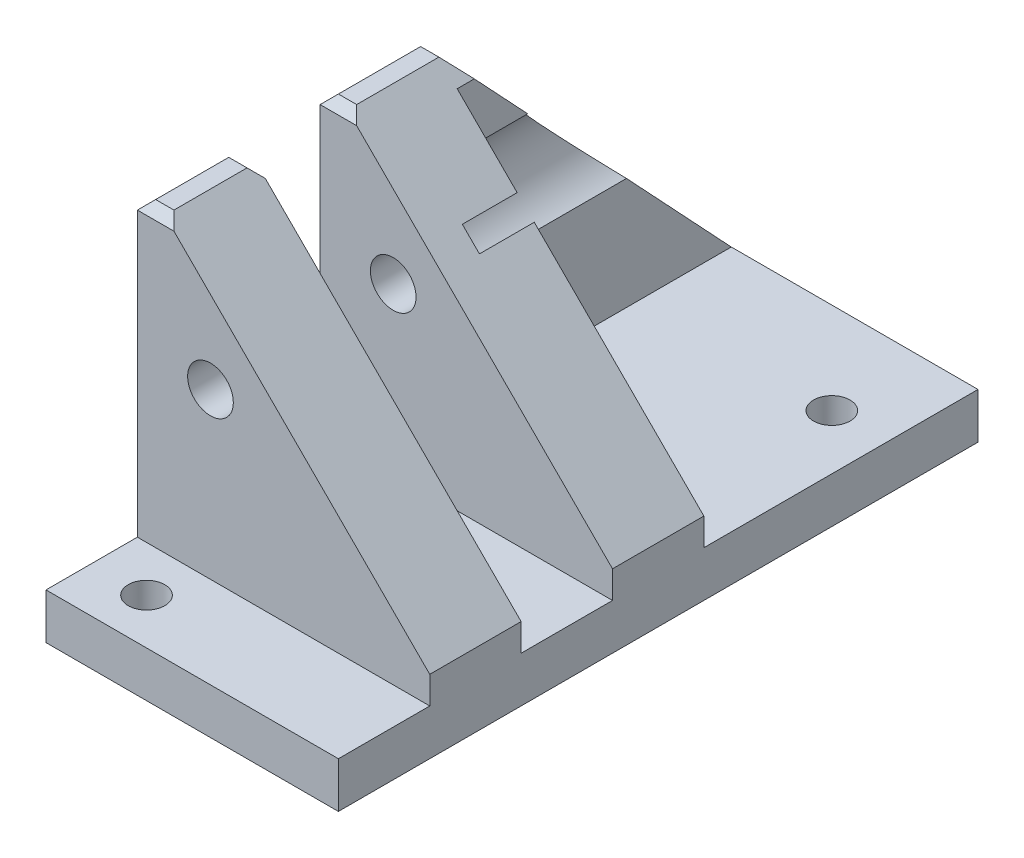
ISO-10303-21;
HEADER;
FILE_DESCRIPTION(('STEP AP214'),'2;1');
FILE_NAME('part.step','',(''),(''),'','','');
FILE_SCHEMA(('AUTOMOTIVE_DESIGN { 1 0 10303 214 1 1 1 1 }'));
ENDSEC;
DATA;
#1=APPLICATION_CONTEXT('core data for automotive mechanical design processes');
#2=APPLICATION_PROTOCOL_DEFINITION('international standard','automotive_design',2000,#1);
#3=PRODUCT_CONTEXT('',#1,'mechanical');
#4=PRODUCT('Part','Part','',(#3));
#5=PRODUCT_RELATED_PRODUCT_CATEGORY('part','',(#4));
#6=PRODUCT_DEFINITION_FORMATION('','',#4);
#7=PRODUCT_DEFINITION_CONTEXT('part definition',#1,'design');
#8=PRODUCT_DEFINITION('design','',#6,#7);
#9=PRODUCT_DEFINITION_SHAPE('','',#8);
#10=(LENGTH_UNIT() NAMED_UNIT(*) SI_UNIT(.MILLI.,.METRE.));
#11=(NAMED_UNIT(*) PLANE_ANGLE_UNIT() SI_UNIT($,.RADIAN.));
#12=(NAMED_UNIT(*) SI_UNIT($,.STERADIAN.) SOLID_ANGLE_UNIT());
#13=UNCERTAINTY_MEASURE_WITH_UNIT(LENGTH_MEASURE(1.E-05),#10,'distance_accuracy_value','');
#14=(GEOMETRIC_REPRESENTATION_CONTEXT(3) GLOBAL_UNCERTAINTY_ASSIGNED_CONTEXT((#13)) GLOBAL_UNIT_ASSIGNED_CONTEXT((#10,
#11,#12)) REPRESENTATION_CONTEXT('',''));
#15=CARTESIAN_POINT('',(0.,0.,0.));
#16=DIRECTION('',(0.,0.,1.));
#17=DIRECTION('',(1.,0.,0.));
#18=AXIS2_PLACEMENT_3D('',#15,#16,#17);
#19=CARTESIAN_POINT('',(5.00000000000001,5.,30.));
#20=DIRECTION('',(0.,0.,1.));
#21=DIRECTION('',(1.,0.,0.));
#22=AXIS2_PLACEMENT_3D('',#19,#20,#21);
#23=PLANE('',#22);
#24=DIRECTION('',(-0.707106781186548,0.707106781186547,0.));
#25=VECTOR('',#24,1.);
#26=CARTESIAN_POINT('',(0.,40.,30.));
#27=LINE('',#26,#25);
#28=CARTESIAN_POINT('',(11.5645856533065,28.4354143466935,30.));
#29=VERTEX_POINT('',#28);
#30=CARTESIAN_POINT('',(5.00000000000001,35.,30.));
#31=VERTEX_POINT('',#30);
#32=EDGE_CURVE('E346',#29,#31,#27,.T.);
#33=ORIENTED_EDGE('',*,*,#32,.F.);
#34=CARTESIAN_POINT('',(8.00000000000001,23.,30.));
#35=DIRECTION('',(0.,0.,1.));
#36=DIRECTION('',(1.,0.,0.));
#37=AXIS2_PLACEMENT_3D('',#34,#35,#36);
#38=CIRCLE('',#37,6.5);
#39=CARTESIAN_POINT('',(5.00000000000001,28.7662812973354,30.));
#40=VERTEX_POINT('',#39);
#41=EDGE_CURVE('E193',#29,#40,#38,.T.);
#42=ORIENTED_EDGE('',*,*,#41,.T.);
#43=DIRECTION('',(0.,-1.,0.));
#44=VECTOR('',#43,1.);
#45=CARTESIAN_POINT('',(5.00000000000001,5.,30.));
#46=LINE('',#45,#44);
#47=EDGE_CURVE('E258',#31,#40,#46,.T.);
#48=ORIENTED_EDGE('',*,*,#47,.F.);
#49=EDGE_LOOP('',(#33,#42,#48));
#50=FACE_BOUND('',#49,.T.);
#51=ADVANCED_FACE('F33',(#50),#23,.F.);
#52=CARTESIAN_POINT('',(5.00000000000001,37.,30.));
#53=DIRECTION('',(-1.,0.,0.));
#54=DIRECTION('',(0.,0.,1.));
#55=AXIS2_PLACEMENT_3D('',#52,#53,#54);
#56=PLANE('',#55);
#57=ORIENTED_EDGE('',*,*,#47,.T.);
#58=DIRECTION('',(0.,0.,-1.));
#59=VECTOR('',#58,1.);
#60=CARTESIAN_POINT('',(5.00000000000001,28.7662812973354,36.));
#61=LINE('',#60,#59);
#62=CARTESIAN_POINT('',(5.00000000000001,28.7662812973354,22.2808887162519));
#63=VERTEX_POINT('',#62);
#64=EDGE_CURVE('E212',#40,#63,#61,.T.);
#65=ORIENTED_EDGE('',*,*,#64,.T.);
#66=DIRECTION('',(0.,-0.729537204140085,-0.68394112888133));
#67=VECTOR('',#66,1.);
#68=CARTESIAN_POINT('',(5.00000000000001,37.,30.));
#69=LINE('',#68,#67);
#70=CARTESIAN_POINT('',(5.00000000000001,35.,28.125));
#71=VERTEX_POINT('',#70);
#72=EDGE_CURVE('E239',#71,#63,#69,.T.);
#73=ORIENTED_EDGE('',*,*,#72,.F.);
#74=DIRECTION('',(0.,0.,-1.));
#75=VECTOR('',#74,1.);
#76=CARTESIAN_POINT('',(5.00000000000001,35.,0.));
#77=LINE('',#76,#75);
#78=EDGE_CURVE('E343',#31,#71,#77,.T.);
#79=ORIENTED_EDGE('',*,*,#78,.F.);
#80=EDGE_LOOP('',(#57,#65,#73,#79));
#81=FACE_BOUND('',#80,.T.);
#82=ADVANCED_FACE('F451',(#81),#56,.F.);
#83=CARTESIAN_POINT('',(8.00000000000001,23.,0.));
#84=DIRECTION('',(0.,0.,1.));
#85=DIRECTION('',(1.,0.,0.));
#86=AXIS2_PLACEMENT_3D('',#83,#84,#85);
#87=CYLINDRICAL_SURFACE('',#86,2.5);
#88=CARTESIAN_POINT('',(8.00000000000001,23.,40.));
#89=DIRECTION('',(0.,0.,-1.));
#90=DIRECTION('',(0.,1.,0.));
#91=AXIS2_PLACEMENT_3D('',#88,#89,#90);
#92=CIRCLE('',#91,2.5);
#93=CARTESIAN_POINT('',(8.00000000000001,25.5,40.));
#94=VERTEX_POINT('',#93);
#95=EDGE_CURVE('E197',#94,#94,#92,.T.);
#96=ORIENTED_EDGE('',*,*,#95,.F.);
#97=EDGE_LOOP('',(#96));
#98=FACE_BOUND('',#97,.T.);
#99=CARTESIAN_POINT('',(8.00000000000001,23.,36.));
#100=DIRECTION('',(0.,0.,-1.));
#101=DIRECTION('',(-1.,0.,0.));
#102=AXIS2_PLACEMENT_3D('',#99,#100,#101);
#103=CIRCLE('',#102,2.5);
#104=CARTESIAN_POINT('',(5.50000000000001,23.,36.));
#105=VERTEX_POINT('',#104);
#106=EDGE_CURVE('E203',#105,#105,#103,.F.);
#107=ORIENTED_EDGE('',*,*,#106,.F.);
#108=EDGE_LOOP('',(#107));
#109=FACE_BOUND('',#108,.T.);
#110=ADVANCED_FACE('F460',(#98,#109),#87,.F.);
#111=CARTESIAN_POINT('',(0.,50.,70.));
#112=DIRECTION('',(1.,0.,0.));
#113=DIRECTION('',(0.,1.,0.));
#114=AXIS2_PLACEMENT_3D('',#111,#112,#113);
#115=PLANE('',#114);
#116=DIRECTION('',(0.,1.,0.));
#117=VECTOR('',#116,1.);
#118=CARTESIAN_POINT('',(0.,50.,40.));
#119=LINE('',#118,#117);
#120=CARTESIAN_POINT('',(0.,5.,40.));
#121=VERTEX_POINT('',#120);
#122=CARTESIAN_POINT('',(0.,36.,40.));
#123=VERTEX_POINT('',#122);
#124=EDGE_CURVE('E291',#121,#123,#119,.T.);
#125=ORIENTED_EDGE('',*,*,#124,.T.);
#126=DIRECTION('',(0.,0.,-1.));
#127=VECTOR('',#126,1.);
#128=CARTESIAN_POINT('',(0.,36.,70.));
#129=LINE('',#128,#127);
#130=CARTESIAN_POINT('',(0.,36.,29.0625));
#131=VERTEX_POINT('',#130);
#132=EDGE_CURVE('E367',#123,#131,#129,.T.);
#133=ORIENTED_EDGE('',*,*,#132,.T.);
#134=DIRECTION('',(0.,-0.729537204140085,-0.68394112888133));
#135=VECTOR('',#134,1.);
#136=CARTESIAN_POINT('',(0.,37.,30.));
#137=LINE('',#136,#135);
#138=CARTESIAN_POINT('',(0.,5.,0.));
#139=VERTEX_POINT('',#138);
#140=EDGE_CURVE('E242',#131,#139,#137,.T.);
#141=ORIENTED_EDGE('',*,*,#140,.T.);
#142=DIRECTION('',(0.,-1.,0.));
#143=VECTOR('',#142,1.);
#144=CARTESIAN_POINT('',(0.,50.,0.));
#145=LINE('',#144,#143);
#146=CARTESIAN_POINT('',(0.,0.,0.));
#147=VERTEX_POINT('',#146);
#148=EDGE_CURVE('E321',#139,#147,#145,.T.);
#149=ORIENTED_EDGE('',*,*,#148,.T.);
#150=DIRECTION('',(0.,0.,-1.));
#151=VECTOR('',#150,1.);
#152=CARTESIAN_POINT('',(0.,0.,70.));
#153=LINE('',#152,#151);
#154=CARTESIAN_POINT('',(0.,0.,70.));
#155=VERTEX_POINT('',#154);
#156=EDGE_CURVE('E331',#155,#147,#153,.T.);
#157=ORIENTED_EDGE('',*,*,#156,.F.);
#158=DIRECTION('',(0.,-1.,0.));
#159=VECTOR('',#158,1.);
#160=CARTESIAN_POINT('',(0.,50.,70.));
#161=LINE('',#160,#159);
#162=CARTESIAN_POINT('',(0.,5.,70.));
#163=VERTEX_POINT('',#162);
#164=EDGE_CURVE('E326',#163,#155,#161,.T.);
#165=ORIENTED_EDGE('',*,*,#164,.F.);
#166=DIRECTION('',(0.,0.,-1.));
#167=VECTOR('',#166,1.);
#168=CARTESIAN_POINT('',(0.,5.,70.));
#169=LINE('',#168,#167);
#170=CARTESIAN_POINT('',(0.,5.,60.));
#171=VERTEX_POINT('',#170);
#172=EDGE_CURVE('E304',#163,#171,#169,.T.);
#173=ORIENTED_EDGE('',*,*,#172,.T.);
#174=DIRECTION('',(0.,1.,0.));
#175=VECTOR('',#174,1.);
#176=CARTESIAN_POINT('',(0.,50.,60.));
#177=LINE('',#176,#175);
#178=CARTESIAN_POINT('',(0.,36.,60.));
#179=VERTEX_POINT('',#178);
#180=EDGE_CURVE('E307',#171,#179,#177,.T.);
#181=ORIENTED_EDGE('',*,*,#180,.T.);
#182=DIRECTION('',(0.,0.,-1.));
#183=VECTOR('',#182,1.);
#184=CARTESIAN_POINT('',(0.,36.,70.));
#185=LINE('',#184,#183);
#186=CARTESIAN_POINT('',(0.,36.,50.));
#187=VERTEX_POINT('',#186);
#188=EDGE_CURVE('E365',#179,#187,#185,.T.);
#189=ORIENTED_EDGE('',*,*,#188,.T.);
#190=DIRECTION('',(0.,-1.,0.));
#191=VECTOR('',#190,1.);
#192=CARTESIAN_POINT('',(0.,50.,50.));
#193=LINE('',#192,#191);
#194=CARTESIAN_POINT('',(0.,5.,50.));
#195=VERTEX_POINT('',#194);
#196=EDGE_CURVE('E286',#187,#195,#193,.T.);
#197=ORIENTED_EDGE('',*,*,#196,.T.);
#198=DIRECTION('',(0.,0.,-1.));
#199=VECTOR('',#198,1.);
#200=CARTESIAN_POINT('',(0.,5.,50.));
#201=LINE('',#200,#199);
#202=EDGE_CURVE('E288',#195,#121,#201,.T.);
#203=ORIENTED_EDGE('',*,*,#202,.T.);
#204=EDGE_LOOP('',(#125,#133,#141,#149,#157,#165,#173,#181,#189,#197,#203));
#205=FACE_BOUND('',#204,.T.);
#206=ADVANCED_FACE('F408',(#205),#115,.F.);
#207=CARTESIAN_POINT('',(0.,0.,70.));
#208=DIRECTION('',(0.,1.,0.));
#209=DIRECTION('',(0.,0.,1.));
#210=AXIS2_PLACEMENT_3D('',#207,#208,#209);
#211=PLANE('',#210);
#212=CARTESIAN_POINT('',(26.,0.,10.));
#213=DIRECTION('',(0.,-1.,0.));
#214=DIRECTION('',(0.,0.,-1.));
#215=AXIS2_PLACEMENT_3D('',#212,#213,#214);
#216=CIRCLE('',#215,2.);
#217=CARTESIAN_POINT('',(26.,0.,8.));
#218=VERTEX_POINT('',#217);
#219=EDGE_CURVE('E231',#218,#218,#216,.T.);
#220=ORIENTED_EDGE('',*,*,#219,.F.);
#221=EDGE_LOOP('',(#220));
#222=FACE_BOUND('',#221,.T.);
#223=CARTESIAN_POINT('',(6.,0.,65.));
#224=DIRECTION('',(0.,-1.,0.));
#225=DIRECTION('',(0.,0.,-1.));
#226=AXIS2_PLACEMENT_3D('',#223,#224,#225);
#227=CIRCLE('',#226,2.);
#228=CARTESIAN_POINT('',(6.,0.,63.));
#229=VERTEX_POINT('',#228);
#230=EDGE_CURVE('E235',#229,#229,#227,.T.);
#231=ORIENTED_EDGE('',*,*,#230,.F.);
#232=EDGE_LOOP('',(#231));
#233=FACE_BOUND('',#232,.T.);
#234=DIRECTION('',(1.,0.,0.));
#235=VECTOR('',#234,1.);
#236=CARTESIAN_POINT('',(0.,0.,0.));
#237=LINE('',#236,#235);
#238=CARTESIAN_POINT('',(32.,0.,0.));
#239=VERTEX_POINT('',#238);
#240=EDGE_CURVE('E323',#147,#239,#237,.T.);
#241=ORIENTED_EDGE('',*,*,#240,.T.);
#242=DIRECTION('',(0.,0.,1.));
#243=VECTOR('',#242,1.);
#244=CARTESIAN_POINT('',(32.,0.,0.));
#245=LINE('',#244,#243);
#246=CARTESIAN_POINT('',(32.,0.,70.));
#247=VERTEX_POINT('',#246);
#248=EDGE_CURVE('E318',#239,#247,#245,.T.);
#249=ORIENTED_EDGE('',*,*,#248,.T.);
#250=DIRECTION('',(1.,0.,0.));
#251=VECTOR('',#250,1.);
#252=CARTESIAN_POINT('',(0.,0.,70.));
#253=LINE('',#252,#251);
#254=EDGE_CURVE('E328',#155,#247,#253,.T.);
#255=ORIENTED_EDGE('',*,*,#254,.F.);
#256=ORIENTED_EDGE('',*,*,#156,.T.);
#257=EDGE_LOOP('',(#241,#249,#255,#256));
#258=FACE_BOUND('',#257,.T.);
#259=ADVANCED_FACE('F488',(#222,#233,#258),#211,.F.);
#260=CARTESIAN_POINT('',(0.,0.,70.));
#261=DIRECTION('',(0.,0.,1.));
#262=DIRECTION('',(1.,0.,0.));
#263=AXIS2_PLACEMENT_3D('',#260,#261,#262);
#264=PLANE('',#263);
#265=DIRECTION('',(1.,0.,0.));
#266=VECTOR('',#265,1.);
#267=CARTESIAN_POINT('',(0.,5.,70.));
#268=LINE('',#267,#266);
#269=CARTESIAN_POINT('',(32.,5.,70.));
#270=VERTEX_POINT('',#269);
#271=EDGE_CURVE('E310',#163,#270,#268,.T.);
#272=ORIENTED_EDGE('',*,*,#271,.F.);
#273=ORIENTED_EDGE('',*,*,#164,.T.);
#274=ORIENTED_EDGE('',*,*,#254,.T.);
#275=DIRECTION('',(0.,-1.,0.));
#276=VECTOR('',#275,1.);
#277=CARTESIAN_POINT('',(32.,0.,70.));
#278=LINE('',#277,#276);
#279=EDGE_CURVE('E313',#270,#247,#278,.T.);
#280=ORIENTED_EDGE('',*,*,#279,.F.);
#281=EDGE_LOOP('',(#272,#273,#274,#280));
#282=FACE_BOUND('',#281,.T.);
#283=ADVANCED_FACE('F491',(#282),#264,.T.);
#284=CARTESIAN_POINT('',(0.,0.,0.));
#285=DIRECTION('',(0.,0.,1.));
#286=DIRECTION('',(1.,0.,0.));
#287=AXIS2_PLACEMENT_3D('',#284,#285,#286);
#288=PLANE('',#287);
#289=ORIENTED_EDGE('',*,*,#148,.F.);
#290=DIRECTION('',(1.,0.,0.));
#291=VECTOR('',#290,1.);
#292=CARTESIAN_POINT('',(0.,5.,0.));
#293=LINE('',#292,#291);
#294=CARTESIAN_POINT('',(5.00000000000001,5.,0.));
#295=VERTEX_POINT('',#294);
#296=EDGE_CURVE('E245',#139,#295,#293,.T.);
#297=ORIENTED_EDGE('',*,*,#296,.T.);
#298=DIRECTION('',(1.,0.,0.));
#299=VECTOR('',#298,1.);
#300=CARTESIAN_POINT('',(5.00000000000001,5.,0.));
#301=LINE('',#300,#299);
#302=CARTESIAN_POINT('',(32.,5.,0.));
#303=VERTEX_POINT('',#302);
#304=EDGE_CURVE('E265',#295,#303,#301,.T.);
#305=ORIENTED_EDGE('',*,*,#304,.T.);
#306=DIRECTION('',(0.,-1.,0.));
#307=VECTOR('',#306,1.);
#308=CARTESIAN_POINT('',(32.,0.,0.));
#309=LINE('',#308,#307);
#310=EDGE_CURVE('E316',#303,#239,#309,.T.);
#311=ORIENTED_EDGE('',*,*,#310,.T.);
#312=ORIENTED_EDGE('',*,*,#240,.F.);
#313=EDGE_LOOP('',(#289,#297,#305,#311,#312));
#314=FACE_BOUND('',#313,.T.);
#315=ADVANCED_FACE('F479',(#314),#288,.F.);
#316=CARTESIAN_POINT('',(32.,0.,0.));
#317=DIRECTION('',(-1.,0.,0.));
#318=DIRECTION('',(0.,0.,1.));
#319=AXIS2_PLACEMENT_3D('',#316,#317,#318);
#320=PLANE('',#319);
#321=DIRECTION('',(0.,0.,-1.));
#322=VECTOR('',#321,1.);
#323=CARTESIAN_POINT('',(32.,5.,30.));
#324=LINE('',#323,#322);
#325=CARTESIAN_POINT('',(32.,5.,30.));
#326=VERTEX_POINT('',#325);
#327=EDGE_CURVE('E255',#326,#303,#324,.T.);
#328=ORIENTED_EDGE('',*,*,#327,.F.);
#329=DIRECTION('',(0.,-1.,0.));
#330=VECTOR('',#329,1.);
#331=CARTESIAN_POINT('',(32.,5.,30.));
#332=LINE('',#331,#330);
#333=CARTESIAN_POINT('',(32.,8.00000000000002,30.));
#334=VERTEX_POINT('',#333);
#335=EDGE_CURVE('E253',#334,#326,#332,.T.);
#336=ORIENTED_EDGE('',*,*,#335,.F.);
#337=DIRECTION('',(0.,0.,1.));
#338=VECTOR('',#337,1.);
#339=CARTESIAN_POINT('',(32.,8.00000000000002,0.));
#340=LINE('',#339,#338);
#341=CARTESIAN_POINT('',(32.,8.00000000000002,40.));
#342=VERTEX_POINT('',#341);
#343=EDGE_CURVE('E273',#334,#342,#340,.T.);
#344=ORIENTED_EDGE('',*,*,#343,.T.);
#345=DIRECTION('',(0.,1.,0.));
#346=VECTOR('',#345,1.);
#347=CARTESIAN_POINT('',(32.,50.,40.));
#348=LINE('',#347,#346);
#349=CARTESIAN_POINT('',(32.,5.,40.));
#350=VERTEX_POINT('',#349);
#351=EDGE_CURVE('E283',#350,#342,#348,.T.);
#352=ORIENTED_EDGE('',*,*,#351,.F.);
#353=DIRECTION('',(0.,0.,-1.));
#354=VECTOR('',#353,1.);
#355=CARTESIAN_POINT('',(32.,5.,50.));
#356=LINE('',#355,#354);
#357=CARTESIAN_POINT('',(32.,5.,50.));
#358=VERTEX_POINT('',#357);
#359=EDGE_CURVE('E280',#358,#350,#356,.T.);
#360=ORIENTED_EDGE('',*,*,#359,.F.);
#361=DIRECTION('',(0.,1.,0.));
#362=VECTOR('',#361,1.);
#363=CARTESIAN_POINT('',(32.,0.,50.));
#364=LINE('',#363,#362);
#365=CARTESIAN_POINT('',(32.,8.,50.));
#366=VERTEX_POINT('',#365);
#367=EDGE_CURVE('E334',#358,#366,#364,.T.);
#368=ORIENTED_EDGE('',*,*,#367,.T.);
#369=CARTESIAN_POINT('',(32.,8.00000000000002,60.));
#370=VERTEX_POINT('',#369);
#371=EDGE_CURVE('E272',#366,#370,#340,.T.);
#372=ORIENTED_EDGE('',*,*,#371,.T.);
#373=DIRECTION('',(0.,1.,0.));
#374=VECTOR('',#373,1.);
#375=CARTESIAN_POINT('',(32.,50.,60.));
#376=LINE('',#375,#374);
#377=CARTESIAN_POINT('',(32.,5.,60.));
#378=VERTEX_POINT('',#377);
#379=EDGE_CURVE('E301',#378,#370,#376,.T.);
#380=ORIENTED_EDGE('',*,*,#379,.F.);
#381=DIRECTION('',(0.,0.,-1.));
#382=VECTOR('',#381,1.);
#383=CARTESIAN_POINT('',(32.,5.,70.));
#384=LINE('',#383,#382);
#385=EDGE_CURVE('E297',#270,#378,#384,.T.);
#386=ORIENTED_EDGE('',*,*,#385,.F.);
#387=ORIENTED_EDGE('',*,*,#279,.T.);
#388=ORIENTED_EDGE('',*,*,#248,.F.);
#389=ORIENTED_EDGE('',*,*,#310,.F.);
#390=EDGE_LOOP('',(#328,#336,#344,#352,#360,#368,#372,#380,#386,#387,#388,#389));
#391=FACE_BOUND('',#390,.T.);
#392=ADVANCED_FACE('F417',(#391),#320,.F.);
#393=CARTESIAN_POINT('',(0.,50.,60.));
#394=DIRECTION('',(0.,0.,-1.));
#395=DIRECTION('',(0.,1.,0.));
#396=AXIS2_PLACEMENT_3D('',#393,#394,#395);
#397=PLANE('',#396);
#398=CARTESIAN_POINT('',(8.00000000000001,23.,60.));
#399=DIRECTION('',(0.,0.,-1.));
#400=DIRECTION('',(0.,1.,0.));
#401=AXIS2_PLACEMENT_3D('',#398,#399,#400);
#402=CIRCLE('',#401,2.5);
#403=CARTESIAN_POINT('',(8.00000000000001,25.5,60.));
#404=VERTEX_POINT('',#403);
#405=EDGE_CURVE('E228',#404,#404,#402,.T.);
#406=ORIENTED_EDGE('',*,*,#405,.T.);
#407=EDGE_LOOP('',(#406));
#408=FACE_BOUND('',#407,.T.);
#409=DIRECTION('',(-0.707106781186548,0.707106781186547,0.));
#410=VECTOR('',#409,1.);
#411=CARTESIAN_POINT('',(-5.,45.,60.));
#412=LINE('',#411,#410);
#413=CARTESIAN_POINT('',(4.,36.,60.));
#414=VERTEX_POINT('',#413);
#415=EDGE_CURVE('E277',#370,#414,#412,.T.);
#416=ORIENTED_EDGE('',*,*,#415,.T.);
#417=DIRECTION('',(-1.,0.,0.));
#418=VECTOR('',#417,1.);
#419=CARTESIAN_POINT('',(0.,36.,60.));
#420=LINE('',#419,#418);
#421=EDGE_CURVE('E11',#414,#179,#420,.T.);
#422=ORIENTED_EDGE('',*,*,#421,.T.);
#423=ORIENTED_EDGE('',*,*,#180,.F.);
#424=DIRECTION('',(1.,0.,0.));
#425=VECTOR('',#424,1.);
#426=CARTESIAN_POINT('',(0.,5.,60.));
#427=LINE('',#426,#425);
#428=EDGE_CURVE('E311',#171,#378,#427,.T.);
#429=ORIENTED_EDGE('',*,*,#428,.T.);
#430=ORIENTED_EDGE('',*,*,#379,.T.);
#431=EDGE_LOOP('',(#416,#422,#423,#429,#430));
#432=FACE_BOUND('',#431,.T.);
#433=ADVANCED_FACE('F412',(#408,#432),#397,.F.);
#434=CARTESIAN_POINT('',(0.,5.,70.));
#435=DIRECTION('',(0.,-1.,0.));
#436=DIRECTION('',(0.,0.,-1.));
#437=AXIS2_PLACEMENT_3D('',#434,#435,#436);
#438=PLANE('',#437);
#439=CARTESIAN_POINT('',(6.,5.,65.));
#440=DIRECTION('',(0.,-1.,0.));
#441=DIRECTION('',(0.,0.,-1.));
#442=AXIS2_PLACEMENT_3D('',#439,#440,#441);
#443=CIRCLE('',#442,2.);
#444=CARTESIAN_POINT('',(6.,5.,63.));
#445=VERTEX_POINT('',#444);
#446=EDGE_CURVE('E238',#445,#445,#443,.T.);
#447=ORIENTED_EDGE('',*,*,#446,.T.);
#448=EDGE_LOOP('',(#447));
#449=FACE_BOUND('',#448,.T.);
#450=ORIENTED_EDGE('',*,*,#385,.T.);
#451=ORIENTED_EDGE('',*,*,#428,.F.);
#452=ORIENTED_EDGE('',*,*,#172,.F.);
#453=ORIENTED_EDGE('',*,*,#271,.T.);
#454=EDGE_LOOP('',(#450,#451,#452,#453));
#455=FACE_BOUND('',#454,.T.);
#456=ADVANCED_FACE('F494',(#449,#455),#438,.F.);
#457=CARTESIAN_POINT('',(0.,50.,50.));
#458=DIRECTION('',(0.,0.,1.));
#459=DIRECTION('',(0.,-1.,0.));
#460=AXIS2_PLACEMENT_3D('',#457,#458,#459);
#461=PLANE('',#460);
#462=CARTESIAN_POINT('',(8.00000000000001,23.,50.));
#463=DIRECTION('',(0.,0.,1.));
#464=DIRECTION('',(0.,-1.,0.));
#465=AXIS2_PLACEMENT_3D('',#462,#463,#464);
#466=CIRCLE('',#465,2.5);
#467=CARTESIAN_POINT('',(8.00000000000001,20.5,50.));
#468=VERTEX_POINT('',#467);
#469=EDGE_CURVE('E225',#468,#468,#466,.T.);
#470=ORIENTED_EDGE('',*,*,#469,.T.);
#471=EDGE_LOOP('',(#470));
#472=FACE_BOUND('',#471,.T.);
#473=ORIENTED_EDGE('',*,*,#196,.F.);
#474=DIRECTION('',(1.,0.,0.));
#475=VECTOR('',#474,1.);
#476=CARTESIAN_POINT('',(0.,36.,50.));
#477=LINE('',#476,#475);
#478=CARTESIAN_POINT('',(4.,36.,50.));
#479=VERTEX_POINT('',#478);
#480=EDGE_CURVE('E371',#187,#479,#477,.T.);
#481=ORIENTED_EDGE('',*,*,#480,.T.);
#482=DIRECTION('',(0.707106781186548,-0.707106781186547,0.));
#483=VECTOR('',#482,1.);
#484=CARTESIAN_POINT('',(-5.,45.,50.));
#485=LINE('',#484,#483);
#486=EDGE_CURVE('E275',#479,#366,#485,.T.);
#487=ORIENTED_EDGE('',*,*,#486,.T.);
#488=ORIENTED_EDGE('',*,*,#367,.F.);
#489=DIRECTION('',(1.,0.,0.));
#490=VECTOR('',#489,1.);
#491=CARTESIAN_POINT('',(0.,5.,50.));
#492=LINE('',#491,#490);
#493=EDGE_CURVE('E294',#195,#358,#492,.T.);
#494=ORIENTED_EDGE('',*,*,#493,.F.);
#495=EDGE_LOOP('',(#473,#481,#487,#488,#494));
#496=FACE_BOUND('',#495,.T.);
#497=ADVANCED_FACE('F403',(#472,#496),#461,.F.);
#498=CARTESIAN_POINT('',(0.,50.,40.));
#499=DIRECTION('',(0.,0.,-1.));
#500=DIRECTION('',(0.,1.,0.));
#501=AXIS2_PLACEMENT_3D('',#498,#499,#500);
#502=PLANE('',#501);
#503=ORIENTED_EDGE('',*,*,#95,.T.);
#504=EDGE_LOOP('',(#503));
#505=FACE_BOUND('',#504,.T.);
#506=DIRECTION('',(-0.707106781186548,0.707106781186547,0.));
#507=VECTOR('',#506,1.);
#508=CARTESIAN_POINT('',(-5.,45.,40.));
#509=LINE('',#508,#507);
#510=CARTESIAN_POINT('',(4.,36.,40.));
#511=VERTEX_POINT('',#510);
#512=EDGE_CURVE('E337',#342,#511,#509,.T.);
#513=ORIENTED_EDGE('',*,*,#512,.T.);
#514=DIRECTION('',(-1.,0.,0.));
#515=VECTOR('',#514,1.);
#516=CARTESIAN_POINT('',(0.,36.,40.));
#517=LINE('',#516,#515);
#518=EDGE_CURVE('E356',#511,#123,#517,.T.);
#519=ORIENTED_EDGE('',*,*,#518,.T.);
#520=ORIENTED_EDGE('',*,*,#124,.F.);
#521=DIRECTION('',(1.,0.,0.));
#522=VECTOR('',#521,1.);
#523=CARTESIAN_POINT('',(0.,5.,40.));
#524=LINE('',#523,#522);
#525=EDGE_CURVE('E295',#121,#350,#524,.T.);
#526=ORIENTED_EDGE('',*,*,#525,.T.);
#527=ORIENTED_EDGE('',*,*,#351,.T.);
#528=EDGE_LOOP('',(#513,#519,#520,#526,#527));
#529=FACE_BOUND('',#528,.T.);
#530=ADVANCED_FACE('F425',(#505,#529),#502,.F.);
#531=CARTESIAN_POINT('',(0.,5.,50.));
#532=DIRECTION('',(0.,-1.,0.));
#533=DIRECTION('',(0.,0.,-1.));
#534=AXIS2_PLACEMENT_3D('',#531,#532,#533);
#535=PLANE('',#534);
#536=ORIENTED_EDGE('',*,*,#359,.T.);
#537=ORIENTED_EDGE('',*,*,#525,.F.);
#538=ORIENTED_EDGE('',*,*,#202,.F.);
#539=ORIENTED_EDGE('',*,*,#493,.T.);
#540=EDGE_LOOP('',(#536,#537,#538,#539));
#541=FACE_BOUND('',#540,.T.);
#542=ADVANCED_FACE('F422',(#541),#535,.F.);
#543=CARTESIAN_POINT('',(0.,40.,0.));
#544=DIRECTION('',(-0.707106781186547,-0.707106781186548,0.));
#545=DIRECTION('',(0.707106781186548,-0.707106781186547,0.));
#546=AXIS2_PLACEMENT_3D('',#543,#544,#545);
#547=PLANE('',#546);
#548=DIRECTION('',(0.,0.,1.));
#549=VECTOR('',#548,1.);
#550=CARTESIAN_POINT('',(3.00000000000001,37.,0.));
#551=LINE('',#550,#549);
#552=CARTESIAN_POINT('',(3.00000000000001,37.,30.));
#553=VERTEX_POINT('',#552);
#554=CARTESIAN_POINT('',(3.00000000000001,37.,39.));
#555=VERTEX_POINT('',#554);
#556=EDGE_CURVE('E268',#553,#555,#551,.T.);
#557=ORIENTED_EDGE('',*,*,#556,.T.);
#558=DIRECTION('',(-0.577350269189627,0.577350269189627,-0.577350269189623));
#559=VECTOR('',#558,1.);
#560=CARTESIAN_POINT('',(2.66666666666667,37.3333333333333,38.6666666666667));
#561=LINE('',#560,#559);
#562=EDGE_CURVE('E363',#555,#511,#561,.F.);
#563=ORIENTED_EDGE('',*,*,#562,.T.);
#564=ORIENTED_EDGE('',*,*,#512,.F.);
#565=ORIENTED_EDGE('',*,*,#343,.F.);
#566=CARTESIAN_POINT('',(13.4354143466935,26.5645856533065,30.));
#567=VERTEX_POINT('',#566);
#568=EDGE_CURVE('E347',#334,#567,#27,.T.);
#569=ORIENTED_EDGE('',*,*,#568,.T.);
#570=DIRECTION('',(0.,0.,-1.));
#571=VECTOR('',#570,1.);
#572=CARTESIAN_POINT('',(13.4354143466935,26.5645856533066,36.));
#573=LINE('',#572,#571);
#574=CARTESIAN_POINT('',(13.4354143466935,26.5645856533065,36.));
#575=VERTEX_POINT('',#574);
#576=EDGE_CURVE('E198',#567,#575,#573,.F.);
#577=ORIENTED_EDGE('',*,*,#576,.T.);
#578=DIRECTION('',(0.707106781186548,-0.707106781186547,0.));
#579=VECTOR('',#578,1.);
#580=CARTESIAN_POINT('',(0.,40.,36.));
#581=LINE('',#580,#579);
#582=CARTESIAN_POINT('',(11.5645856533065,28.4354143466935,36.));
#583=VERTEX_POINT('',#582);
#584=EDGE_CURVE('E202',#583,#575,#581,.T.);
#585=ORIENTED_EDGE('',*,*,#584,.F.);
#586=DIRECTION('',(0.,0.,-1.));
#587=VECTOR('',#586,1.);
#588=CARTESIAN_POINT('',(11.5645856533065,28.4354143466935,36.));
#589=LINE('',#588,#587);
#590=EDGE_CURVE('E187',#583,#29,#589,.T.);
#591=ORIENTED_EDGE('',*,*,#590,.T.);
#592=ORIENTED_EDGE('',*,*,#32,.T.);
#593=ORIENTED_EDGE('',*,*,#78,.T.);
#594=DIRECTION('',(-0.589367574947006,0.589367574947006,0.552532101512818));
#595=VECTOR('',#594,1.);
#596=CARTESIAN_POINT('',(10.685210312076,29.314789687924,22.7951153324288));
#597=LINE('',#596,#595);
#598=EDGE_CURVE('E248',#71,#553,#597,.T.);
#599=ORIENTED_EDGE('',*,*,#598,.T.);
#600=EDGE_LOOP('',(#557,#563,#564,#565,#569,#577,#585,#591,#592,#593,#599));
#601=FACE_BOUND('',#600,.T.);
#602=ADVANCED_FACE('F207',(#601),#547,.F.);
#603=ORIENTED_EDGE('',*,*,#486,.F.);
#604=DIRECTION('',(0.577350269189627,-0.577350269189627,-0.577350269189623));
#605=VECTOR('',#604,1.);
#606=CARTESIAN_POINT('',(2.66666666666667,37.3333333333333,51.3333333333333));
#607=LINE('',#606,#605);
#608=CARTESIAN_POINT('',(3.00000000000001,37.,51.));
#609=VERTEX_POINT('',#608);
#610=EDGE_CURVE('E376',#479,#609,#607,.F.);
#611=ORIENTED_EDGE('',*,*,#610,.T.);
#612=DIRECTION('',(0.,0.,1.));
#613=VECTOR('',#612,1.);
#614=CARTESIAN_POINT('',(3.00000000000001,37.,0.));
#615=LINE('',#614,#613);
#616=CARTESIAN_POINT('',(3.00000000000001,37.,59.));
#617=VERTEX_POINT('',#616);
#618=EDGE_CURVE('E340',#609,#617,#615,.T.);
#619=ORIENTED_EDGE('',*,*,#618,.T.);
#620=DIRECTION('',(-0.577350269189627,0.577350269189627,-0.577350269189623));
#621=VECTOR('',#620,1.);
#622=CARTESIAN_POINT('',(2.66666666666667,37.3333333333333,58.6666666666667));
#623=LINE('',#622,#621);
#624=EDGE_CURVE('E374',#617,#414,#623,.F.);
#625=ORIENTED_EDGE('',*,*,#624,.T.);
#626=ORIENTED_EDGE('',*,*,#415,.F.);
#627=ORIENTED_EDGE('',*,*,#371,.F.);
#628=EDGE_LOOP('',(#603,#611,#619,#625,#626,#627));
#629=FACE_BOUND('',#628,.T.);
#630=ADVANCED_FACE('F398',(#629),#547,.F.);
#631=CARTESIAN_POINT('',(0.,37.,0.));
#632=DIRECTION('',(0.,-1.,0.));
#633=DIRECTION('',(0.,0.,-1.));
#634=AXIS2_PLACEMENT_3D('',#631,#632,#633);
#635=PLANE('',#634);
#636=ORIENTED_EDGE('',*,*,#618,.F.);
#637=DIRECTION('',(-1.,0.,0.));
#638=VECTOR('',#637,1.);
#639=CARTESIAN_POINT('',(0.,37.,51.));
#640=LINE('',#639,#638);
#641=CARTESIAN_POINT('',(0.999999999999998,37.,51.));
#642=VERTEX_POINT('',#641);
#643=EDGE_CURVE('E42',#609,#642,#640,.T.);
#644=ORIENTED_EDGE('',*,*,#643,.T.);
#645=DIRECTION('',(0.,0.,1.));
#646=VECTOR('',#645,1.);
#647=CARTESIAN_POINT('',(0.999999999999998,37.,0.));
#648=LINE('',#647,#646);
#649=CARTESIAN_POINT('',(0.999999999999998,37.,59.));
#650=VERTEX_POINT('',#649);
#651=EDGE_CURVE('E50',#642,#650,#648,.T.);
#652=ORIENTED_EDGE('',*,*,#651,.T.);
#653=DIRECTION('',(1.,0.,0.));
#654=VECTOR('',#653,1.);
#655=CARTESIAN_POINT('',(0.,37.,59.));
#656=LINE('',#655,#654);
#657=EDGE_CURVE('E379',#650,#617,#656,.T.);
#658=ORIENTED_EDGE('',*,*,#657,.T.);
#659=EDGE_LOOP('',(#636,#644,#652,#658));
#660=FACE_BOUND('',#659,.T.);
#661=ADVANCED_FACE('F395',(#660),#635,.F.);
#662=DIRECTION('',(0.,0.,1.));
#663=VECTOR('',#662,1.);
#664=CARTESIAN_POINT('',(0.999999999999998,37.,0.));
#665=LINE('',#664,#663);
#666=CARTESIAN_POINT('',(0.999999999999994,37.,30.));
#667=VERTEX_POINT('',#666);
#668=CARTESIAN_POINT('',(0.999999999999998,37.,39.));
#669=VERTEX_POINT('',#668);
#670=EDGE_CURVE('E359',#667,#669,#665,.T.);
#671=ORIENTED_EDGE('',*,*,#670,.T.);
#672=DIRECTION('',(1.,0.,0.));
#673=VECTOR('',#672,1.);
#674=CARTESIAN_POINT('',(0.,37.,39.));
#675=LINE('',#674,#673);
#676=EDGE_CURVE('E361',#669,#555,#675,.T.);
#677=ORIENTED_EDGE('',*,*,#676,.T.);
#678=ORIENTED_EDGE('',*,*,#556,.F.);
#679=DIRECTION('',(1.,0.,0.));
#680=VECTOR('',#679,1.);
#681=CARTESIAN_POINT('',(0.,37.,30.));
#682=LINE('',#681,#680);
#683=EDGE_CURVE('E246',#667,#553,#682,.T.);
#684=ORIENTED_EDGE('',*,*,#683,.F.);
#685=EDGE_LOOP('',(#671,#677,#678,#684));
#686=FACE_BOUND('',#685,.T.);
#687=ADVANCED_FACE('F441',(#686),#635,.F.);
#688=CARTESIAN_POINT('',(5.00000000000001,17.2337187026646,30.));
#689=VERTEX_POINT('',#688);
#690=CARTESIAN_POINT('',(5.00000000000001,5.,30.));
#691=VERTEX_POINT('',#690);
#692=EDGE_CURVE('E257',#689,#691,#46,.T.);
#693=ORIENTED_EDGE('',*,*,#692,.F.);
#694=EDGE_CURVE('E219',#689,#567,#38,.T.);
#695=ORIENTED_EDGE('',*,*,#694,.T.);
#696=ORIENTED_EDGE('',*,*,#568,.F.);
#697=ORIENTED_EDGE('',*,*,#335,.T.);
#698=DIRECTION('',(1.,0.,0.));
#699=VECTOR('',#698,1.);
#700=CARTESIAN_POINT('',(5.00000000000001,5.,30.));
#701=LINE('',#700,#699);
#702=EDGE_CURVE('E264',#691,#326,#701,.T.);
#703=ORIENTED_EDGE('',*,*,#702,.F.);
#704=EDGE_LOOP('',(#693,#695,#696,#697,#703));
#705=FACE_BOUND('',#704,.T.);
#706=ADVANCED_FACE('F456',(#705),#23,.F.);
#707=CARTESIAN_POINT('',(5.00000000000001,17.2337187026646,11.4691112837481));
#708=VERTEX_POINT('',#707);
#709=EDGE_CURVE('E243',#708,#295,#69,.T.);
#710=ORIENTED_EDGE('',*,*,#709,.F.);
#711=DIRECTION('',(0.,0.,-1.));
#712=VECTOR('',#711,1.);
#713=CARTESIAN_POINT('',(5.00000000000001,17.2337187026646,36.));
#714=LINE('',#713,#712);
#715=EDGE_CURVE('E209',#708,#689,#714,.F.);
#716=ORIENTED_EDGE('',*,*,#715,.T.);
#717=ORIENTED_EDGE('',*,*,#692,.T.);
#718=DIRECTION('',(0.,0.,-1.));
#719=VECTOR('',#718,1.);
#720=CARTESIAN_POINT('',(5.00000000000001,5.,30.));
#721=LINE('',#720,#719);
#722=EDGE_CURVE('E261',#691,#295,#721,.T.);
#723=ORIENTED_EDGE('',*,*,#722,.T.);
#724=EDGE_LOOP('',(#710,#716,#717,#723));
#725=FACE_BOUND('',#724,.T.);
#726=ADVANCED_FACE('F462',(#725),#56,.F.);
#727=CARTESIAN_POINT('',(5.00000000000001,5.,30.));
#728=DIRECTION('',(0.,-1.,0.));
#729=DIRECTION('',(0.,0.,-1.));
#730=AXIS2_PLACEMENT_3D('',#727,#728,#729);
#731=PLANE('',#730);
#732=CARTESIAN_POINT('',(26.,5.,10.));
#733=DIRECTION('',(0.,-1.,0.));
#734=DIRECTION('',(0.,0.,-1.));
#735=AXIS2_PLACEMENT_3D('',#732,#733,#734);
#736=CIRCLE('',#735,2.);
#737=CARTESIAN_POINT('',(26.,5.,8.));
#738=VERTEX_POINT('',#737);
#739=EDGE_CURVE('E234',#738,#738,#736,.T.);
#740=ORIENTED_EDGE('',*,*,#739,.T.);
#741=EDGE_LOOP('',(#740));
#742=FACE_BOUND('',#741,.T.);
#743=ORIENTED_EDGE('',*,*,#327,.T.);
#744=ORIENTED_EDGE('',*,*,#304,.F.);
#745=ORIENTED_EDGE('',*,*,#722,.F.);
#746=ORIENTED_EDGE('',*,*,#702,.T.);
#747=EDGE_LOOP('',(#743,#744,#745,#746));
#748=FACE_BOUND('',#747,.T.);
#749=ADVANCED_FACE('F471',(#742,#748),#731,.F.);
#750=CARTESIAN_POINT('',(0.,37.,30.));
#751=DIRECTION('',(0.,-0.68394112888133,0.729537204140085));
#752=DIRECTION('',(0.,-0.729537204140085,-0.68394112888133));
#753=AXIS2_PLACEMENT_3D('',#750,#751,#752);
#754=PLANE('',#753);
#755=ORIENTED_EDGE('',*,*,#140,.F.);
#756=DIRECTION('',(-0.589367574947003,-0.589367574947007,-0.552532101512819));
#757=VECTOR('',#756,1.);
#758=CARTESIAN_POINT('',(-8.76933514246945,27.2306648575305,20.8412483039348));
#759=LINE('',#758,#757);
#760=EDGE_CURVE('E369',#131,#667,#759,.F.);
#761=ORIENTED_EDGE('',*,*,#760,.T.);
#762=ORIENTED_EDGE('',*,*,#683,.T.);
#763=ORIENTED_EDGE('',*,*,#598,.F.);
#764=ORIENTED_EDGE('',*,*,#72,.T.);
#765=CARTESIAN_POINT('',(8.00000000000001,23.,16.875));
#766=DIRECTION('',(0.,-0.68394112888133,0.729537204140085));
#767=DIRECTION('',(0.,-0.729537204140085,-0.68394112888133));
#768=AXIS2_PLACEMENT_3D('',#765,#766,#767);
#769=ELLIPSE('',#768,8.90975808103116,6.5);
#770=EDGE_CURVE('E349',#63,#708,#769,.T.);
#771=ORIENTED_EDGE('',*,*,#770,.T.);
#772=ORIENTED_EDGE('',*,*,#709,.T.);
#773=ORIENTED_EDGE('',*,*,#296,.F.);
#774=EDGE_LOOP('',(#755,#761,#762,#763,#764,#771,#772,#773));
#775=FACE_BOUND('',#774,.T.);
#776=ADVANCED_FACE('F434',(#775),#754,.F.);
#777=CARTESIAN_POINT('',(6.,27.,65.));
#778=DIRECTION('',(0.,-1.,0.));
#779=DIRECTION('',(0.,0.,-1.));
#780=AXIS2_PLACEMENT_3D('',#777,#778,#779);
#781=CYLINDRICAL_SURFACE('',#780,2.);
#782=ORIENTED_EDGE('',*,*,#230,.T.);
#783=EDGE_LOOP('',(#782));
#784=FACE_BOUND('',#783,.T.);
#785=ORIENTED_EDGE('',*,*,#446,.F.);
#786=EDGE_LOOP('',(#785));
#787=FACE_BOUND('',#786,.T.);
#788=ADVANCED_FACE('F568',(#784,#787),#781,.F.);
#789=CARTESIAN_POINT('',(26.,27.,10.));
#790=DIRECTION('',(0.,-1.,0.));
#791=DIRECTION('',(0.,0.,-1.));
#792=AXIS2_PLACEMENT_3D('',#789,#790,#791);
#793=CYLINDRICAL_SURFACE('',#792,2.);
#794=ORIENTED_EDGE('',*,*,#219,.T.);
#795=EDGE_LOOP('',(#794));
#796=FACE_BOUND('',#795,.T.);
#797=ORIENTED_EDGE('',*,*,#739,.F.);
#798=EDGE_LOOP('',(#797));
#799=FACE_BOUND('',#798,.T.);
#800=ADVANCED_FACE('F560',(#796,#799),#793,.F.);
#801=ORIENTED_EDGE('',*,*,#469,.F.);
#802=EDGE_LOOP('',(#801));
#803=FACE_BOUND('',#802,.T.);
#804=ORIENTED_EDGE('',*,*,#405,.F.);
#805=EDGE_LOOP('',(#804));
#806=FACE_BOUND('',#805,.T.);
#807=ADVANCED_FACE('F552',(#803,#806),#87,.F.);
#808=CARTESIAN_POINT('',(8.00000000000001,23.,36.));
#809=DIRECTION('',(0.,0.,-1.));
#810=DIRECTION('',(-1.,0.,0.));
#811=AXIS2_PLACEMENT_3D('',#808,#809,#810);
#812=CYLINDRICAL_SURFACE('',#811,6.5);
#813=CARTESIAN_POINT('',(8.00000000000001,23.,36.));
#814=DIRECTION('',(0.,0.,-1.));
#815=DIRECTION('',(-1.,0.,0.));
#816=AXIS2_PLACEMENT_3D('',#813,#814,#815);
#817=CIRCLE('',#816,6.5);
#818=EDGE_CURVE('E190',#575,#583,#817,.T.);
#819=ORIENTED_EDGE('',*,*,#818,.F.);
#820=ORIENTED_EDGE('',*,*,#576,.F.);
#821=ORIENTED_EDGE('',*,*,#694,.F.);
#822=ORIENTED_EDGE('',*,*,#715,.F.);
#823=ORIENTED_EDGE('',*,*,#770,.F.);
#824=ORIENTED_EDGE('',*,*,#64,.F.);
#825=ORIENTED_EDGE('',*,*,#41,.F.);
#826=ORIENTED_EDGE('',*,*,#590,.F.);
#827=EDGE_LOOP('',(#819,#820,#821,#822,#823,#824,#825,#826));
#828=FACE_BOUND('',#827,.T.);
#829=ADVANCED_FACE('F189',(#828),#812,.F.);
#830=CARTESIAN_POINT('',(8.00000000000001,23.,36.));
#831=DIRECTION('',(0.,0.,-1.));
#832=DIRECTION('',(-1.,0.,0.));
#833=AXIS2_PLACEMENT_3D('',#830,#831,#832);
#834=PLANE('',#833);
#835=ORIENTED_EDGE('',*,*,#106,.T.);
#836=EDGE_LOOP('',(#835));
#837=FACE_BOUND('',#836,.T.);
#838=ORIENTED_EDGE('',*,*,#584,.T.);
#839=ORIENTED_EDGE('',*,*,#818,.T.);
#840=EDGE_LOOP('',(#838,#839));
#841=FACE_BOUND('',#840,.T.);
#842=ADVANCED_FACE('F201',(#837,#841),#834,.T.);
#843=CARTESIAN_POINT('',(0.999999999999998,37.,0.));
#844=DIRECTION('',(0.70710678118655,-0.707106781186545,0.));
#845=DIRECTION('',(0.707106781186545,0.70710678118655,0.));
#846=AXIS2_PLACEMENT_3D('',#843,#844,#845);
#847=PLANE('',#846);
#848=ORIENTED_EDGE('',*,*,#760,.F.);
#849=ORIENTED_EDGE('',*,*,#132,.F.);
#850=DIRECTION('',(0.577350269189624,0.577350269189628,-0.577350269189624));
#851=VECTOR('',#850,1.);
#852=CARTESIAN_POINT('',(13.9999999999999,50.,26.0000000000001));
#853=LINE('',#852,#851);
#854=EDGE_CURVE('E204',#669,#123,#853,.F.);
#855=ORIENTED_EDGE('',*,*,#854,.F.);
#856=ORIENTED_EDGE('',*,*,#670,.F.);
#857=EDGE_LOOP('',(#848,#849,#855,#856));
#858=FACE_BOUND('',#857,.T.);
#859=ADVANCED_FACE('F438',(#858),#847,.F.);
#860=CARTESIAN_POINT('',(0.,36.,40.));
#861=DIRECTION('',(0.,-0.707106781186545,-0.70710678118655));
#862=DIRECTION('',(0.,0.70710678118655,-0.707106781186545));
#863=AXIS2_PLACEMENT_3D('',#860,#861,#862);
#864=PLANE('',#863);
#865=ORIENTED_EDGE('',*,*,#562,.F.);
#866=ORIENTED_EDGE('',*,*,#676,.F.);
#867=ORIENTED_EDGE('',*,*,#854,.T.);
#868=ORIENTED_EDGE('',*,*,#518,.F.);
#869=EDGE_LOOP('',(#865,#866,#867,#868));
#870=FACE_BOUND('',#869,.T.);
#871=ADVANCED_FACE('F445',(#870),#864,.F.);
#872=CARTESIAN_POINT('',(0.,36.,60.));
#873=DIRECTION('',(0.,-0.707106781186545,-0.70710678118655));
#874=DIRECTION('',(0.,0.70710678118655,-0.707106781186545));
#875=AXIS2_PLACEMENT_3D('',#872,#873,#874);
#876=PLANE('',#875);
#877=ORIENTED_EDGE('',*,*,#624,.F.);
#878=ORIENTED_EDGE('',*,*,#657,.F.);
#879=DIRECTION('',(0.577350269189624,0.577350269189628,-0.577350269189624));
#880=VECTOR('',#879,1.);
#881=CARTESIAN_POINT('',(20.6666666666666,56.6666666666667,39.3333333333334));
#882=LINE('',#881,#880);
#883=EDGE_CURVE('E37',#179,#650,#882,.T.);
#884=ORIENTED_EDGE('',*,*,#883,.F.);
#885=ORIENTED_EDGE('',*,*,#421,.F.);
#886=EDGE_LOOP('',(#877,#878,#884,#885));
#887=FACE_BOUND('',#886,.T.);
#888=ADVANCED_FACE('F35',(#887),#876,.F.);
#889=CARTESIAN_POINT('',(0.999999999999998,37.,0.));
#890=DIRECTION('',(0.70710678118655,-0.707106781186545,0.));
#891=DIRECTION('',(0.707106781186545,0.70710678118655,0.));
#892=AXIS2_PLACEMENT_3D('',#889,#890,#891);
#893=PLANE('',#892);
#894=ORIENTED_EDGE('',*,*,#883,.T.);
#895=ORIENTED_EDGE('',*,*,#651,.F.);
#896=DIRECTION('',(-0.577350269189624,-0.577350269189628,-0.577350269189624));
#897=VECTOR('',#896,1.);
#898=CARTESIAN_POINT('',(-15.9999999999999,20.,34.0000000000001));
#899=LINE('',#898,#897);
#900=EDGE_CURVE('E382',#187,#642,#899,.F.);
#901=ORIENTED_EDGE('',*,*,#900,.F.);
#902=ORIENTED_EDGE('',*,*,#188,.F.);
#903=EDGE_LOOP('',(#894,#895,#901,#902));
#904=FACE_BOUND('',#903,.T.);
#905=ADVANCED_FACE('F391',(#904),#893,.F.);
#906=CARTESIAN_POINT('',(0.,36.,50.));
#907=DIRECTION('',(0.,-0.707106781186545,0.70710678118655));
#908=DIRECTION('',(0.,-0.70710678118655,-0.707106781186545));
#909=AXIS2_PLACEMENT_3D('',#906,#907,#908);
#910=PLANE('',#909);
#911=ORIENTED_EDGE('',*,*,#900,.T.);
#912=ORIENTED_EDGE('',*,*,#643,.F.);
#913=ORIENTED_EDGE('',*,*,#610,.F.);
#914=ORIENTED_EDGE('',*,*,#480,.F.);
#915=EDGE_LOOP('',(#911,#912,#913,#914));
#916=FACE_BOUND('',#915,.T.);
#917=ADVANCED_FACE('F400',(#916),#910,.F.);
#918=CLOSED_SHELL('',(#51,#82,#110,#206,#259,#283,#315,#392,#433,#456,#497,#530,#542,#602,#630,
#661,#687,#706,#726,#749,#776,#788,#800,#807,#829,#842,#859,#871,#888,#905,#917));
#919=MANIFOLD_SOLID_BREP('B2',#918);
#920=ADVANCED_BREP_SHAPE_REPRESENTATION('',(#18,#919),#14);
#921=SHAPE_DEFINITION_REPRESENTATION(#9,#920);
ENDSEC;
END-ISO-10303-21;
